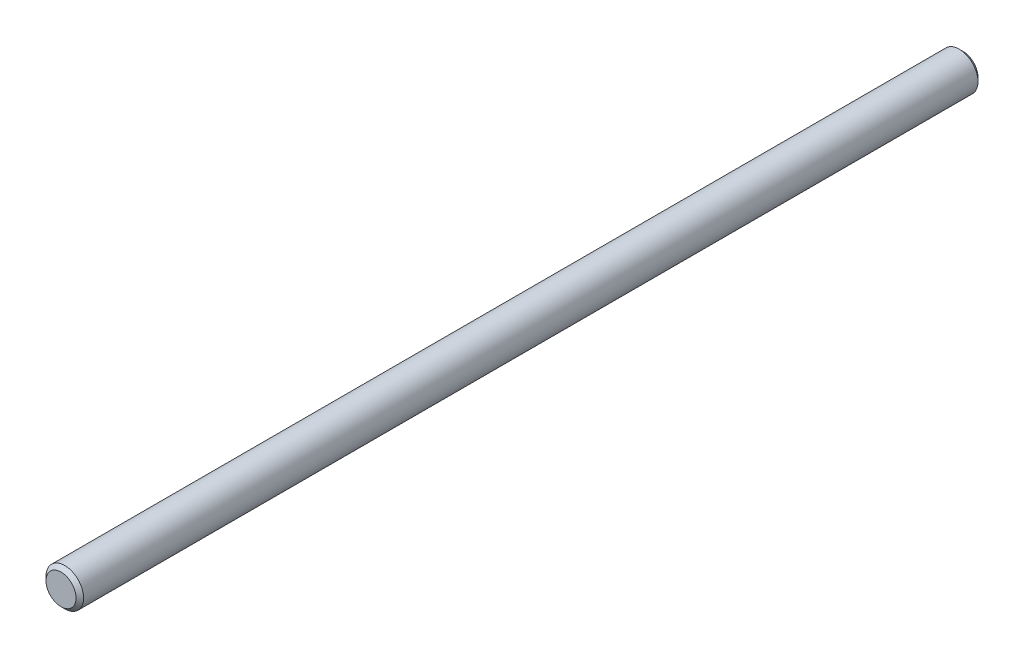
ISO-10303-21;
HEADER;
FILE_DESCRIPTION(('STEP AP214'),'2;1');
FILE_NAME('part.step','',(''),(''),'','','');
FILE_SCHEMA(('AUTOMOTIVE_DESIGN { 1 0 10303 214 1 1 1 1 }'));
ENDSEC;
DATA;
#1=APPLICATION_CONTEXT('core data for automotive mechanical design processes');
#2=APPLICATION_PROTOCOL_DEFINITION('international standard','automotive_design',2000,#1);
#3=PRODUCT_CONTEXT('',#1,'mechanical');
#4=PRODUCT('Part','Part','',(#3));
#5=PRODUCT_RELATED_PRODUCT_CATEGORY('part','',(#4));
#6=PRODUCT_DEFINITION_FORMATION('','',#4);
#7=PRODUCT_DEFINITION_CONTEXT('part definition',#1,'design');
#8=PRODUCT_DEFINITION('design','',#6,#7);
#9=PRODUCT_DEFINITION_SHAPE('','',#8);
#10=(LENGTH_UNIT() NAMED_UNIT(*) SI_UNIT(.MILLI.,.METRE.));
#11=(NAMED_UNIT(*) PLANE_ANGLE_UNIT() SI_UNIT($,.RADIAN.));
#12=(NAMED_UNIT(*) SI_UNIT($,.STERADIAN.) SOLID_ANGLE_UNIT());
#13=UNCERTAINTY_MEASURE_WITH_UNIT(LENGTH_MEASURE(1.E-05),#10,'distance_accuracy_value','');
#14=(GEOMETRIC_REPRESENTATION_CONTEXT(3) GLOBAL_UNCERTAINTY_ASSIGNED_CONTEXT((#13)) GLOBAL_UNIT_ASSIGNED_CONTEXT((#10,
#11,#12)) REPRESENTATION_CONTEXT('',''));
#15=CARTESIAN_POINT('',(0.,0.,0.));
#16=DIRECTION('',(0.,0.,1.));
#17=DIRECTION('',(1.,0.,0.));
#18=AXIS2_PLACEMENT_3D('',#15,#16,#17);
#19=CARTESIAN_POINT('',(0.,0.,76.2));
#20=DIRECTION('',(0.,0.,-1.));
#21=DIRECTION('',(-1.,0.,0.));
#22=AXIS2_PLACEMENT_3D('',#19,#20,#21);
#23=CYLINDRICAL_SURFACE('',#22,3.175);
#24=CARTESIAN_POINT('',(0.,0.,-75.5649999999999));
#25=DIRECTION('',(0.,0.,1.));
#26=DIRECTION('',(1.,0.,0.));
#27=AXIS2_PLACEMENT_3D('',#24,#25,#26);
#28=CIRCLE('',#27,3.175);
#29=CARTESIAN_POINT('',(-3.175,0.,-75.5649999999999));
#30=VERTEX_POINT('',#29);
#31=EDGE_CURVE('E41',#30,#30,#28,.T.);
#32=CARTESIAN_POINT('',(0.,0.,75.5650000000001));
#33=DIRECTION('',(0.,0.,1.));
#34=DIRECTION('',(1.,0.,0.));
#35=AXIS2_PLACEMENT_3D('',#32,#33,#34);
#36=CIRCLE('',#35,3.175);
#37=CARTESIAN_POINT('',(-3.175,0.,75.5650000000001));
#38=VERTEX_POINT('',#37);
#39=EDGE_CURVE('E45',#38,#38,#36,.F.);
#40=CARTESIAN_POINT('',(-3.175,0.,-75.5649999999999));
#41=CARTESIAN_POINT('',(-3.175,0.,-73.9907291666666));
#42=CARTESIAN_POINT('',(-3.175,0.,-72.4164583333332));
#43=CARTESIAN_POINT('',(-3.175,0.,-69.2679166666666));
#44=CARTESIAN_POINT('',(-3.175,0.,-67.6936458333332));
#45=CARTESIAN_POINT('',(-3.175,0.,-64.5451041666666));
#46=CARTESIAN_POINT('',(-3.175,0.,-62.9708333333332));
#47=CARTESIAN_POINT('',(-3.175,0.,-59.8222916666666));
#48=CARTESIAN_POINT('',(-3.175,0.,-58.2480208333332));
#49=CARTESIAN_POINT('',(-3.175,0.,-55.0994791666666));
#50=CARTESIAN_POINT('',(-3.175,0.,-53.5252083333332));
#51=CARTESIAN_POINT('',(-3.175,0.,-50.3766666666666));
#52=CARTESIAN_POINT('',(-3.175,0.,-48.8023958333332));
#53=CARTESIAN_POINT('',(-3.175,0.,-45.6538541666666));
#54=CARTESIAN_POINT('',(-3.175,0.,-44.0795833333332));
#55=CARTESIAN_POINT('',(-3.175,0.,-40.9310416666666));
#56=CARTESIAN_POINT('',(-3.175,0.,-39.3567708333332));
#57=CARTESIAN_POINT('',(-3.175,0.,-36.2082291666666));
#58=CARTESIAN_POINT('',(-3.175,0.,-34.6339583333332));
#59=CARTESIAN_POINT('',(-3.175,0.,-31.4854166666666));
#60=CARTESIAN_POINT('',(-3.175,0.,-29.9111458333332));
#61=CARTESIAN_POINT('',(-3.175,0.,-26.7626041666666));
#62=CARTESIAN_POINT('',(-3.175,0.,-25.1883333333332));
#63=CARTESIAN_POINT('',(-3.175,0.,-22.0397916666666));
#64=CARTESIAN_POINT('',(-3.175,0.,-20.4655208333332));
#65=CARTESIAN_POINT('',(-3.175,0.,-17.3169791666666));
#66=CARTESIAN_POINT('',(-3.175,0.,-15.7427083333332));
#67=CARTESIAN_POINT('',(-3.175,0.,-12.5941666666666));
#68=CARTESIAN_POINT('',(-3.175,0.,-11.0198958333332));
#69=CARTESIAN_POINT('',(-3.175,0.,-7.87135416666657));
#70=CARTESIAN_POINT('',(-3.175,0.,-6.29708333333324));
#71=CARTESIAN_POINT('',(-3.175,0.,-3.14854166666657));
#72=CARTESIAN_POINT('',(-3.175,0.,-1.57427083333324));
#73=CARTESIAN_POINT('',(-3.175,0.,1.57427083333343));
#74=CARTESIAN_POINT('',(-3.175,0.,3.14854166666677));
#75=CARTESIAN_POINT('',(-3.175,0.,6.29708333333343));
#76=CARTESIAN_POINT('',(-3.175,0.,7.87135416666677));
#77=CARTESIAN_POINT('',(-3.175,0.,11.0198958333334));
#78=CARTESIAN_POINT('',(-3.175,0.,12.5941666666668));
#79=CARTESIAN_POINT('',(-3.175,0.,15.7427083333334));
#80=CARTESIAN_POINT('',(-3.175,0.,17.3169791666668));
#81=CARTESIAN_POINT('',(-3.175,0.,20.4655208333334));
#82=CARTESIAN_POINT('',(-3.175,0.,22.0397916666668));
#83=CARTESIAN_POINT('',(-3.175,0.,25.1883333333334));
#84=CARTESIAN_POINT('',(-3.175,0.,26.7626041666668));
#85=CARTESIAN_POINT('',(-3.175,0.,29.9111458333334));
#86=CARTESIAN_POINT('',(-3.175,0.,31.4854166666668));
#87=CARTESIAN_POINT('',(-3.175,0.,34.6339583333334));
#88=CARTESIAN_POINT('',(-3.175,0.,36.2082291666668));
#89=CARTESIAN_POINT('',(-3.175,0.,39.3567708333334));
#90=CARTESIAN_POINT('',(-3.175,0.,40.9310416666668));
#91=CARTESIAN_POINT('',(-3.175,0.,44.0795833333334));
#92=CARTESIAN_POINT('',(-3.175,0.,45.6538541666668));
#93=CARTESIAN_POINT('',(-3.175,0.,48.8023958333334));
#94=CARTESIAN_POINT('',(-3.175,0.,50.3766666666668));
#95=CARTESIAN_POINT('',(-3.175,0.,53.5252083333334));
#96=CARTESIAN_POINT('',(-3.175,0.,55.0994791666668));
#97=CARTESIAN_POINT('',(-3.175,0.,58.2480208333334));
#98=CARTESIAN_POINT('',(-3.175,0.,59.8222916666668));
#99=CARTESIAN_POINT('',(-3.175,0.,62.9708333333334));
#100=CARTESIAN_POINT('',(-3.175,0.,64.5451041666668));
#101=CARTESIAN_POINT('',(-3.175,0.,67.6936458333334));
#102=CARTESIAN_POINT('',(-3.175,0.,69.2679166666667));
#103=CARTESIAN_POINT('',(-3.175,0.,72.4164583333334));
#104=CARTESIAN_POINT('',(-3.175,0.,73.9907291666668));
#105=CARTESIAN_POINT('',(-3.175,0.,75.5650000000001));
#106=B_SPLINE_CURVE_WITH_KNOTS('',3,(#40,#41,#42,#43,#44,#45,#46,#47,#48,#49,#50,#51,#52,#53,
#54,#55,#56,#57,#58,#59,#60,#61,#62,#63,#64,#65,#66,#67,#68,#69,#70,#71,#72,#73,#74,#75,#76,#77,
#78,#79,#80,#81,#82,#83,#84,#85,#86,#87,#88,#89,#90,#91,#92,#93,#94,#95,#96,#97,#98,#99,#100,
#101,#102,#103,#104,#105),.UNSPECIFIED.,.F.,.F.,(4,2,2,2,2,2,2,2,2,2,2,2,2,2,2,2,2,2,2,2,2,2,2,
2,2,2,2,2,2,2,2,2,4),(0.,4.72281250000001,9.44562500000001,14.1684375,18.89125,23.6140625,
28.336875,33.0596875,37.7825,42.5053125,47.228125,51.9509375,56.67375,61.3965625,66.119375,
70.8421875,75.565,80.2878125,85.010625,89.7334375,94.45625,99.1790625,103.901875,108.6246875,
113.3475,118.0703125,122.793125,127.5159375,132.23875,136.9615625,141.684375,146.4071875,
151.13),.UNSPECIFIED.);
#107=EDGE_CURVE('BSEAM30',#30,#38,#106,.T.);
#108=ORIENTED_EDGE('',*,*,#31,.T.);
#109=ORIENTED_EDGE('',*,*,#39,.T.);
#110=ORIENTED_EDGE('',*,*,#107,.T.);
#111=ORIENTED_EDGE('',*,*,#107,.F.);
#112=EDGE_LOOP('',(#108,#110,#109,#111));
#113=FACE_BOUND('',#112,.T.);
#114=ADVANCED_FACE('F30',(#113),#23,.T.);
#115=CARTESIAN_POINT('',(0.,0.,76.2));
#116=DIRECTION('',(0.,0.,1.));
#117=DIRECTION('',(1.,0.,0.));
#118=AXIS2_PLACEMENT_3D('',#115,#116,#117);
#119=PLANE('',#118);
#120=CARTESIAN_POINT('',(0.,0.,76.2));
#121=DIRECTION('',(0.,0.,1.));
#122=DIRECTION('',(1.,0.,0.));
#123=AXIS2_PLACEMENT_3D('',#120,#121,#122);
#124=CIRCLE('',#123,2.54000000000008);
#125=CARTESIAN_POINT('',(2.54000000000008,0.,76.2));
#126=VERTEX_POINT('',#125);
#127=EDGE_CURVE('E10',#126,#126,#124,.T.);
#128=ORIENTED_EDGE('',*,*,#127,.T.);
#129=EDGE_LOOP('',(#128));
#130=FACE_BOUND('',#129,.T.);
#131=ADVANCED_FACE('F61',(#130),#119,.T.);
#132=CARTESIAN_POINT('',(0.,0.,-76.2));
#133=DIRECTION('',(0.,0.,1.));
#134=DIRECTION('',(1.,0.,0.));
#135=AXIS2_PLACEMENT_3D('',#132,#133,#134);
#136=PLANE('',#135);
#137=CARTESIAN_POINT('',(0.,0.,-76.2));
#138=DIRECTION('',(0.,0.,1.));
#139=DIRECTION('',(1.,0.,0.));
#140=AXIS2_PLACEMENT_3D('',#137,#138,#139);
#141=CIRCLE('',#140,2.53999999999988);
#142=CARTESIAN_POINT('',(2.53999999999988,0.,-76.2));
#143=VERTEX_POINT('',#142);
#144=EDGE_CURVE('E37',#143,#143,#141,.F.);
#145=ORIENTED_EDGE('',*,*,#144,.T.);
#146=EDGE_LOOP('',(#145));
#147=FACE_BOUND('',#146,.T.);
#148=ADVANCED_FACE('F58',(#147),#136,.F.);
#149=CARTESIAN_POINT('',(0.,0.,-75.5649999999999));
#150=DIRECTION('',(0.,0.,1.));
#151=DIRECTION('',(1.,0.,0.));
#152=AXIS2_PLACEMENT_3D('',#149,#150,#151);
#153=CONICAL_SURFACE('',#152,3.175,0.785398163397441);
#154=ORIENTED_EDGE('',*,*,#144,.F.);
#155=EDGE_LOOP('',(#154));
#156=FACE_BOUND('',#155,.T.);
#157=ORIENTED_EDGE('',*,*,#31,.F.);
#158=EDGE_LOOP('',(#157));
#159=FACE_BOUND('',#158,.T.);
#160=ADVANCED_FACE('F54',(#156,#159),#153,.T.);
#161=CARTESIAN_POINT('',(0.,0.,76.2));
#162=DIRECTION('',(0.,0.,-1.));
#163=DIRECTION('',(-1.,0.,0.));
#164=AXIS2_PLACEMENT_3D('',#161,#162,#163);
#165=CONICAL_SURFACE('',#164,2.54000000000008,0.785398163397452);
#166=ORIENTED_EDGE('',*,*,#39,.F.);
#167=EDGE_LOOP('',(#166));
#168=FACE_BOUND('',#167,.T.);
#169=ORIENTED_EDGE('',*,*,#127,.F.);
#170=EDGE_LOOP('',(#169));
#171=FACE_BOUND('',#170,.T.);
#172=ADVANCED_FACE('F32',(#168,#171),#165,.T.);
#173=CLOSED_SHELL('',(#114,#131,#148,#160,#172));
#174=MANIFOLD_SOLID_BREP('B2',#173);
#175=ADVANCED_BREP_SHAPE_REPRESENTATION('',(#18,#174),#14);
#176=SHAPE_DEFINITION_REPRESENTATION(#9,#175);
ENDSEC;
END-ISO-10303-21;
